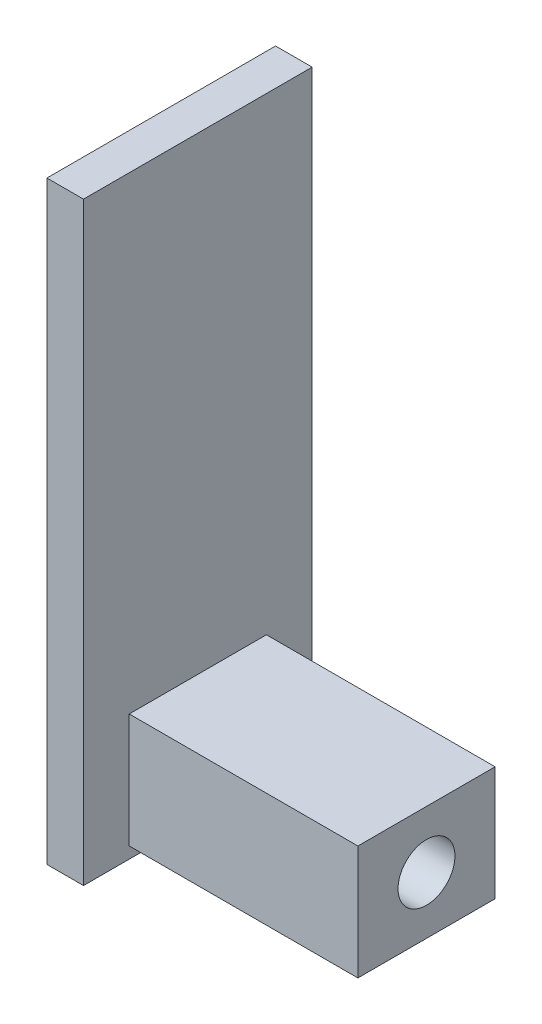
ISO-10303-21;
HEADER;
FILE_DESCRIPTION(('STEP AP214'),'2;1');
FILE_NAME('part.step','',(''),(''),'','','');
FILE_SCHEMA(('AUTOMOTIVE_DESIGN { 1 0 10303 214 1 1 1 1 }'));
ENDSEC;
DATA;
#1=APPLICATION_CONTEXT('core data for automotive mechanical design processes');
#2=APPLICATION_PROTOCOL_DEFINITION('international standard','automotive_design',2000,#1);
#3=PRODUCT_CONTEXT('',#1,'mechanical');
#4=PRODUCT('Part','Part','',(#3));
#5=PRODUCT_RELATED_PRODUCT_CATEGORY('part','',(#4));
#6=PRODUCT_DEFINITION_FORMATION('','',#4);
#7=PRODUCT_DEFINITION_CONTEXT('part definition',#1,'design');
#8=PRODUCT_DEFINITION('design','',#6,#7);
#9=PRODUCT_DEFINITION_SHAPE('','',#8);
#10=(LENGTH_UNIT() NAMED_UNIT(*) SI_UNIT(.MILLI.,.METRE.));
#11=(NAMED_UNIT(*) PLANE_ANGLE_UNIT() SI_UNIT($,.RADIAN.));
#12=(NAMED_UNIT(*) SI_UNIT($,.STERADIAN.) SOLID_ANGLE_UNIT());
#13=UNCERTAINTY_MEASURE_WITH_UNIT(LENGTH_MEASURE(1.E-05),#10,'distance_accuracy_value','');
#14=(GEOMETRIC_REPRESENTATION_CONTEXT(3) GLOBAL_UNCERTAINTY_ASSIGNED_CONTEXT((#13)) GLOBAL_UNIT_ASSIGNED_CONTEXT((#10,
#11,#12)) REPRESENTATION_CONTEXT('',''));
#15=CARTESIAN_POINT('',(0.,0.,0.));
#16=DIRECTION('',(0.,0.,1.));
#17=DIRECTION('',(1.,0.,0.));
#18=AXIS2_PLACEMENT_3D('',#15,#16,#17);
#19=CARTESIAN_POINT('',(8.,0.,0.));
#20=DIRECTION('',(-1.,0.,0.));
#21=DIRECTION('',(0.,0.,1.));
#22=AXIS2_PLACEMENT_3D('',#19,#20,#21);
#23=PLANE('',#22);
#24=DIRECTION('',(0.,-1.,0.));
#25=VECTOR('',#24,1.);
#26=CARTESIAN_POINT('',(8.,0.,0.));
#27=LINE('',#26,#25);
#28=CARTESIAN_POINT('',(8.,130.,0.));
#29=VERTEX_POINT('',#28);
#30=CARTESIAN_POINT('',(8.,0.,0.));
#31=VERTEX_POINT('',#30);
#32=EDGE_CURVE('E128',#29,#31,#27,.T.);
#33=ORIENTED_EDGE('',*,*,#32,.T.);
#34=DIRECTION('',(0.,0.,-1.));
#35=VECTOR('',#34,1.);
#36=CARTESIAN_POINT('',(8.,0.,0.));
#37=LINE('',#36,#35);
#38=CARTESIAN_POINT('',(8.,0.,-50.));
#39=VERTEX_POINT('',#38);
#40=EDGE_CURVE('E131',#31,#39,#37,.T.);
#41=ORIENTED_EDGE('',*,*,#40,.T.);
#42=DIRECTION('',(0.,1.,0.));
#43=VECTOR('',#42,1.);
#44=CARTESIAN_POINT('',(8.,0.,-50.));
#45=LINE('',#44,#43);
#46=CARTESIAN_POINT('',(8.,130.,-50.));
#47=VERTEX_POINT('',#46);
#48=EDGE_CURVE('E134',#39,#47,#45,.T.);
#49=ORIENTED_EDGE('',*,*,#48,.T.);
#50=DIRECTION('',(0.,0.,1.));
#51=VECTOR('',#50,1.);
#52=CARTESIAN_POINT('',(8.,130.,0.));
#53=LINE('',#52,#51);
#54=EDGE_CURVE('E136',#47,#29,#53,.T.);
#55=ORIENTED_EDGE('',*,*,#54,.T.);
#56=EDGE_LOOP('',(#33,#41,#49,#55));
#57=FACE_BOUND('',#56,.T.);
#58=DIRECTION('',(0.,-1.,0.));
#59=VECTOR('',#58,1.);
#60=CARTESIAN_POINT('',(8.,27.5,-10.));
#61=LINE('',#60,#59);
#62=CARTESIAN_POINT('',(8.,27.5,-10.));
#63=VERTEX_POINT('',#62);
#64=CARTESIAN_POINT('',(8.,2.5,-10.));
#65=VERTEX_POINT('',#64);
#66=EDGE_CURVE('E119',#63,#65,#61,.T.);
#67=ORIENTED_EDGE('',*,*,#66,.F.);
#68=DIRECTION('',(0.,0.,1.));
#69=VECTOR('',#68,1.);
#70=CARTESIAN_POINT('',(8.,27.5,-10.));
#71=LINE('',#70,#69);
#72=CARTESIAN_POINT('',(8.,27.5,-40.));
#73=VERTEX_POINT('',#72);
#74=EDGE_CURVE('E116',#73,#63,#71,.T.);
#75=ORIENTED_EDGE('',*,*,#74,.F.);
#76=DIRECTION('',(0.,1.,0.));
#77=VECTOR('',#76,1.);
#78=CARTESIAN_POINT('',(8.,27.5,-40.));
#79=LINE('',#78,#77);
#80=CARTESIAN_POINT('',(8.,2.5,-40.));
#81=VERTEX_POINT('',#80);
#82=EDGE_CURVE('E54',#81,#73,#79,.T.);
#83=ORIENTED_EDGE('',*,*,#82,.F.);
#84=DIRECTION('',(0.,0.,-1.));
#85=VECTOR('',#84,1.);
#86=CARTESIAN_POINT('',(8.,2.5,-10.));
#87=LINE('',#86,#85);
#88=EDGE_CURVE('E49',#65,#81,#87,.T.);
#89=ORIENTED_EDGE('',*,*,#88,.F.);
#90=EDGE_LOOP('',(#67,#75,#83,#89));
#91=FACE_BOUND('',#90,.T.);
#92=ADVANCED_FACE('F33',(#57,#91),#23,.F.);
#93=CARTESIAN_POINT('',(8.,0.,0.));
#94=DIRECTION('',(0.,0.,-1.));
#95=DIRECTION('',(-1.,0.,0.));
#96=AXIS2_PLACEMENT_3D('',#93,#94,#95);
#97=PLANE('',#96);
#98=DIRECTION('',(0.,-1.,0.));
#99=VECTOR('',#98,1.);
#100=CARTESIAN_POINT('',(0.,0.,0.));
#101=LINE('',#100,#99);
#102=CARTESIAN_POINT('',(0.,130.,0.));
#103=VERTEX_POINT('',#102);
#104=CARTESIAN_POINT('',(0.,0.,0.));
#105=VERTEX_POINT('',#104);
#106=EDGE_CURVE('E139',#103,#105,#101,.T.);
#107=ORIENTED_EDGE('',*,*,#106,.T.);
#108=DIRECTION('',(-1.,0.,0.));
#109=VECTOR('',#108,1.);
#110=CARTESIAN_POINT('',(8.,0.,0.));
#111=LINE('',#110,#109);
#112=EDGE_CURVE('E11',#31,#105,#111,.T.);
#113=ORIENTED_EDGE('',*,*,#112,.F.);
#114=ORIENTED_EDGE('',*,*,#32,.F.);
#115=DIRECTION('',(-1.,0.,0.));
#116=VECTOR('',#115,1.);
#117=CARTESIAN_POINT('',(8.,130.,0.));
#118=LINE('',#117,#116);
#119=EDGE_CURVE('E138',#29,#103,#118,.T.);
#120=ORIENTED_EDGE('',*,*,#119,.T.);
#121=EDGE_LOOP('',(#107,#113,#114,#120));
#122=FACE_BOUND('',#121,.T.);
#123=ADVANCED_FACE('F35',(#122),#97,.F.);
#124=CARTESIAN_POINT('',(8.,0.,0.));
#125=DIRECTION('',(0.,1.,0.));
#126=DIRECTION('',(0.,0.,1.));
#127=AXIS2_PLACEMENT_3D('',#124,#125,#126);
#128=PLANE('',#127);
#129=DIRECTION('',(0.,0.,-1.));
#130=VECTOR('',#129,1.);
#131=CARTESIAN_POINT('',(0.,0.,0.));
#132=LINE('',#131,#130);
#133=CARTESIAN_POINT('',(0.,0.,-50.));
#134=VERTEX_POINT('',#133);
#135=EDGE_CURVE('E142',#105,#134,#132,.T.);
#136=ORIENTED_EDGE('',*,*,#135,.T.);
#137=DIRECTION('',(-1.,0.,0.));
#138=VECTOR('',#137,1.);
#139=CARTESIAN_POINT('',(8.,0.,-50.));
#140=LINE('',#139,#138);
#141=EDGE_CURVE('E42',#39,#134,#140,.T.);
#142=ORIENTED_EDGE('',*,*,#141,.F.);
#143=ORIENTED_EDGE('',*,*,#40,.F.);
#144=ORIENTED_EDGE('',*,*,#112,.T.);
#145=EDGE_LOOP('',(#136,#142,#143,#144));
#146=FACE_BOUND('',#145,.T.);
#147=ADVANCED_FACE('F172',(#146),#128,.F.);
#148=CARTESIAN_POINT('',(8.,0.,-50.));
#149=DIRECTION('',(0.,0.,1.));
#150=DIRECTION('',(1.,0.,0.));
#151=AXIS2_PLACEMENT_3D('',#148,#149,#150);
#152=PLANE('',#151);
#153=DIRECTION('',(0.,1.,0.));
#154=VECTOR('',#153,1.);
#155=CARTESIAN_POINT('',(0.,0.,-50.));
#156=LINE('',#155,#154);
#157=CARTESIAN_POINT('',(0.,130.,-50.));
#158=VERTEX_POINT('',#157);
#159=EDGE_CURVE('E144',#134,#158,#156,.T.);
#160=ORIENTED_EDGE('',*,*,#159,.T.);
#161=DIRECTION('',(-1.,0.,0.));
#162=VECTOR('',#161,1.);
#163=CARTESIAN_POINT('',(8.,130.,-50.));
#164=LINE('',#163,#162);
#165=EDGE_CURVE('E149',#47,#158,#164,.T.);
#166=ORIENTED_EDGE('',*,*,#165,.F.);
#167=ORIENTED_EDGE('',*,*,#48,.F.);
#168=ORIENTED_EDGE('',*,*,#141,.T.);
#169=EDGE_LOOP('',(#160,#166,#167,#168));
#170=FACE_BOUND('',#169,.T.);
#171=ADVANCED_FACE('F157',(#170),#152,.F.);
#172=CARTESIAN_POINT('',(8.,130.,0.));
#173=DIRECTION('',(0.,-1.,0.));
#174=DIRECTION('',(0.,0.,-1.));
#175=AXIS2_PLACEMENT_3D('',#172,#173,#174);
#176=PLANE('',#175);
#177=DIRECTION('',(0.,0.,1.));
#178=VECTOR('',#177,1.);
#179=CARTESIAN_POINT('',(0.,130.,0.));
#180=LINE('',#179,#178);
#181=EDGE_CURVE('E132',#158,#103,#180,.T.);
#182=ORIENTED_EDGE('',*,*,#181,.T.);
#183=ORIENTED_EDGE('',*,*,#119,.F.);
#184=ORIENTED_EDGE('',*,*,#54,.F.);
#185=ORIENTED_EDGE('',*,*,#165,.T.);
#186=EDGE_LOOP('',(#182,#183,#184,#185));
#187=FACE_BOUND('',#186,.T.);
#188=ADVANCED_FACE('F166',(#187),#176,.F.);
#189=CARTESIAN_POINT('',(0.,0.,0.));
#190=DIRECTION('',(-1.,0.,0.));
#191=DIRECTION('',(0.,0.,1.));
#192=AXIS2_PLACEMENT_3D('',#189,#190,#191);
#193=PLANE('',#192);
#194=CARTESIAN_POINT('',(0.,15.,-25.));
#195=DIRECTION('',(-1.,0.,0.));
#196=DIRECTION('',(0.,0.,1.));
#197=AXIS2_PLACEMENT_3D('',#194,#195,#196);
#198=CIRCLE('',#197,11.);
#199=CARTESIAN_POINT('',(0.,15.,-14.));
#200=VERTEX_POINT('',#199);
#201=EDGE_CURVE('E37',#200,#200,#198,.F.);
#202=ORIENTED_EDGE('',*,*,#201,.T.);
#203=EDGE_LOOP('',(#202));
#204=FACE_BOUND('',#203,.T.);
#205=ORIENTED_EDGE('',*,*,#106,.F.);
#206=ORIENTED_EDGE('',*,*,#181,.F.);
#207=ORIENTED_EDGE('',*,*,#159,.F.);
#208=ORIENTED_EDGE('',*,*,#135,.F.);
#209=EDGE_LOOP('',(#205,#206,#207,#208));
#210=FACE_BOUND('',#209,.T.);
#211=ADVANCED_FACE('F163',(#204,#210),#193,.T.);
#212=CARTESIAN_POINT('',(20.,15.,-25.));
#213=DIRECTION('',(-1.,0.,0.));
#214=DIRECTION('',(0.,0.,1.));
#215=AXIS2_PLACEMENT_3D('',#212,#213,#214);
#216=CYLINDRICAL_SURFACE('',#215,11.);
#217=ORIENTED_EDGE('',*,*,#201,.F.);
#218=EDGE_LOOP('',(#217));
#219=FACE_BOUND('',#218,.T.);
#220=CARTESIAN_POINT('',(8.,15.,-25.));
#221=DIRECTION('',(1.,0.,0.));
#222=DIRECTION('',(0.,0.,-1.));
#223=AXIS2_PLACEMENT_3D('',#220,#221,#222);
#224=CIRCLE('',#223,11.);
#225=CARTESIAN_POINT('',(8.,15.,-36.));
#226=VERTEX_POINT('',#225);
#227=EDGE_CURVE('E120',#226,#226,#224,.T.);
#228=ORIENTED_EDGE('',*,*,#227,.T.);
#229=EDGE_LOOP('',(#228));
#230=FACE_BOUND('',#229,.T.);
#231=ADVANCED_FACE('F187',(#219,#230),#216,.F.);
#232=CARTESIAN_POINT('',(8.,0.,0.));
#233=DIRECTION('',(1.,0.,0.));
#234=DIRECTION('',(0.,0.,-1.));
#235=AXIS2_PLACEMENT_3D('',#232,#233,#234);
#236=PLANE('',#235);
#237=CARTESIAN_POINT('',(8.,15.,-25.));
#238=DIRECTION('',(1.,0.,0.));
#239=DIRECTION('',(0.,0.,-1.));
#240=AXIS2_PLACEMENT_3D('',#237,#238,#239);
#241=CIRCLE('',#240,6.223);
#242=CARTESIAN_POINT('',(8.,15.,-31.223));
#243=VERTEX_POINT('',#242);
#244=EDGE_CURVE('E270',#243,#243,#241,.T.);
#245=ORIENTED_EDGE('',*,*,#244,.T.);
#246=EDGE_LOOP('',(#245));
#247=FACE_BOUND('',#246,.T.);
#248=ORIENTED_EDGE('',*,*,#227,.F.);
#249=EDGE_LOOP('',(#248));
#250=FACE_BOUND('',#249,.T.);
#251=ADVANCED_FACE('F206',(#247,#250),#236,.F.);
#252=CARTESIAN_POINT('',(58.,27.5,-10.));
#253=DIRECTION('',(0.,0.,-1.));
#254=DIRECTION('',(0.,1.,0.));
#255=AXIS2_PLACEMENT_3D('',#252,#253,#254);
#256=PLANE('',#255);
#257=ORIENTED_EDGE('',*,*,#66,.T.);
#258=DIRECTION('',(-1.,0.,0.));
#259=VECTOR('',#258,1.);
#260=CARTESIAN_POINT('',(58.,2.5,-10.));
#261=LINE('',#260,#259);
#262=CARTESIAN_POINT('',(58.,2.5,-10.));
#263=VERTEX_POINT('',#262);
#264=EDGE_CURVE('E100',#263,#65,#261,.T.);
#265=ORIENTED_EDGE('',*,*,#264,.F.);
#266=DIRECTION('',(0.,-1.,0.));
#267=VECTOR('',#266,1.);
#268=CARTESIAN_POINT('',(58.,27.5,-10.));
#269=LINE('',#268,#267);
#270=CARTESIAN_POINT('',(58.,27.5,-10.));
#271=VERTEX_POINT('',#270);
#272=EDGE_CURVE('E107',#271,#263,#269,.T.);
#273=ORIENTED_EDGE('',*,*,#272,.F.);
#274=DIRECTION('',(-1.,0.,0.));
#275=VECTOR('',#274,1.);
#276=CARTESIAN_POINT('',(58.,27.5,-10.));
#277=LINE('',#276,#275);
#278=EDGE_CURVE('E279',#271,#63,#277,.T.);
#279=ORIENTED_EDGE('',*,*,#278,.T.);
#280=EDGE_LOOP('',(#257,#265,#273,#279));
#281=FACE_BOUND('',#280,.T.);
#282=ADVANCED_FACE('F118',(#281),#256,.F.);
#283=CARTESIAN_POINT('',(58.,2.5,-10.));
#284=DIRECTION('',(0.,1.,0.));
#285=DIRECTION('',(0.,0.,1.));
#286=AXIS2_PLACEMENT_3D('',#283,#284,#285);
#287=PLANE('',#286);
#288=ORIENTED_EDGE('',*,*,#88,.T.);
#289=DIRECTION('',(-1.,0.,0.));
#290=VECTOR('',#289,1.);
#291=CARTESIAN_POINT('',(58.,2.5,-40.));
#292=LINE('',#291,#290);
#293=CARTESIAN_POINT('',(58.,2.5,-40.));
#294=VERTEX_POINT('',#293);
#295=EDGE_CURVE('E103',#294,#81,#292,.T.);
#296=ORIENTED_EDGE('',*,*,#295,.F.);
#297=DIRECTION('',(0.,0.,-1.));
#298=VECTOR('',#297,1.);
#299=CARTESIAN_POINT('',(58.,2.5,-10.));
#300=LINE('',#299,#298);
#301=EDGE_CURVE('E96',#263,#294,#300,.T.);
#302=ORIENTED_EDGE('',*,*,#301,.F.);
#303=ORIENTED_EDGE('',*,*,#264,.T.);
#304=EDGE_LOOP('',(#288,#296,#302,#303));
#305=FACE_BOUND('',#304,.T.);
#306=ADVANCED_FACE('F98',(#305),#287,.F.);
#307=CARTESIAN_POINT('',(58.,27.5,-40.));
#308=DIRECTION('',(0.,0.,1.));
#309=DIRECTION('',(0.,-1.,0.));
#310=AXIS2_PLACEMENT_3D('',#307,#308,#309);
#311=PLANE('',#310);
#312=ORIENTED_EDGE('',*,*,#82,.T.);
#313=DIRECTION('',(-1.,0.,0.));
#314=VECTOR('',#313,1.);
#315=CARTESIAN_POINT('',(58.,27.5,-40.));
#316=LINE('',#315,#314);
#317=CARTESIAN_POINT('',(58.,27.5,-40.));
#318=VERTEX_POINT('',#317);
#319=EDGE_CURVE('E124',#318,#73,#316,.T.);
#320=ORIENTED_EDGE('',*,*,#319,.F.);
#321=DIRECTION('',(0.,1.,0.));
#322=VECTOR('',#321,1.);
#323=CARTESIAN_POINT('',(58.,27.5,-40.));
#324=LINE('',#323,#322);
#325=EDGE_CURVE('E106',#294,#318,#324,.T.);
#326=ORIENTED_EDGE('',*,*,#325,.F.);
#327=ORIENTED_EDGE('',*,*,#295,.T.);
#328=EDGE_LOOP('',(#312,#320,#326,#327));
#329=FACE_BOUND('',#328,.T.);
#330=ADVANCED_FACE('F232',(#329),#311,.F.);
#331=CARTESIAN_POINT('',(58.,27.5,-10.));
#332=DIRECTION('',(0.,-1.,0.));
#333=DIRECTION('',(0.,0.,-1.));
#334=AXIS2_PLACEMENT_3D('',#331,#332,#333);
#335=PLANE('',#334);
#336=ORIENTED_EDGE('',*,*,#74,.T.);
#337=ORIENTED_EDGE('',*,*,#278,.F.);
#338=DIRECTION('',(0.,0.,1.));
#339=VECTOR('',#338,1.);
#340=CARTESIAN_POINT('',(58.,27.5,-10.));
#341=LINE('',#340,#339);
#342=EDGE_CURVE('E112',#318,#271,#341,.T.);
#343=ORIENTED_EDGE('',*,*,#342,.F.);
#344=ORIENTED_EDGE('',*,*,#319,.T.);
#345=EDGE_LOOP('',(#336,#337,#343,#344));
#346=FACE_BOUND('',#345,.T.);
#347=ADVANCED_FACE('F239',(#346),#335,.F.);
#348=CARTESIAN_POINT('',(58.,0.,0.));
#349=DIRECTION('',(1.,0.,0.));
#350=DIRECTION('',(0.,0.,-1.));
#351=AXIS2_PLACEMENT_3D('',#348,#349,#350);
#352=PLANE('',#351);
#353=CARTESIAN_POINT('',(58.,15.,-25.));
#354=DIRECTION('',(1.,0.,0.));
#355=DIRECTION('',(0.,0.,-1.));
#356=AXIS2_PLACEMENT_3D('',#353,#354,#355);
#357=CIRCLE('',#356,6.223);
#358=CARTESIAN_POINT('',(58.,15.,-31.223));
#359=VERTEX_POINT('',#358);
#360=EDGE_CURVE('E273',#359,#359,#357,.T.);
#361=ORIENTED_EDGE('',*,*,#360,.F.);
#362=EDGE_LOOP('',(#361));
#363=FACE_BOUND('',#362,.T.);
#364=ORIENTED_EDGE('',*,*,#272,.T.);
#365=ORIENTED_EDGE('',*,*,#301,.T.);
#366=ORIENTED_EDGE('',*,*,#325,.T.);
#367=ORIENTED_EDGE('',*,*,#342,.T.);
#368=EDGE_LOOP('',(#364,#365,#366,#367));
#369=FACE_BOUND('',#368,.T.);
#370=ADVANCED_FACE('F110',(#363,#369),#352,.T.);
#371=CARTESIAN_POINT('',(8.,15.,-25.));
#372=DIRECTION('',(1.,0.,0.));
#373=DIRECTION('',(0.,0.,-1.));
#374=AXIS2_PLACEMENT_3D('',#371,#372,#373);
#375=CYLINDRICAL_SURFACE('',#374,6.223);
#376=ORIENTED_EDGE('',*,*,#244,.F.);
#377=EDGE_LOOP('',(#376));
#378=FACE_BOUND('',#377,.T.);
#379=ORIENTED_EDGE('',*,*,#360,.T.);
#380=EDGE_LOOP('',(#379));
#381=FACE_BOUND('',#380,.T.);
#382=ADVANCED_FACE('F253',(#378,#381),#375,.F.);
#383=CLOSED_SHELL('',(#92,#123,#147,#171,#188,#211,#231,#251,#282,#306,#330,#347,#370,#382));
#384=MANIFOLD_SOLID_BREP('B2',#383);
#385=ADVANCED_BREP_SHAPE_REPRESENTATION('',(#18,#384),#14);
#386=SHAPE_DEFINITION_REPRESENTATION(#9,#385);
ENDSEC;
END-ISO-10303-21;
